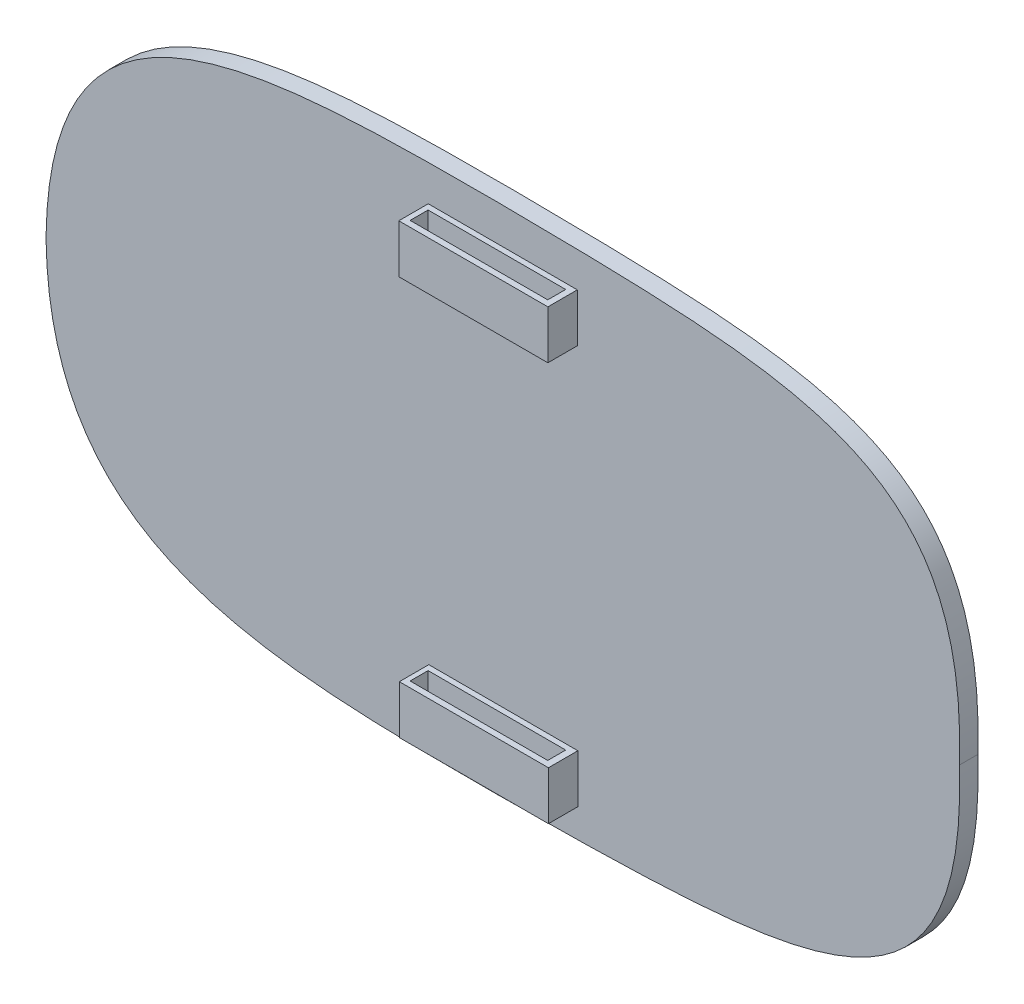
ISO-10303-21;
HEADER;
FILE_DESCRIPTION(('STEP AP214'),'2;1');
FILE_NAME('part.step','',(''),(''),'','','');
FILE_SCHEMA(('AUTOMOTIVE_DESIGN { 1 0 10303 214 1 1 1 1 }'));
ENDSEC;
DATA;
#1=APPLICATION_CONTEXT('core data for automotive mechanical design processes');
#2=APPLICATION_PROTOCOL_DEFINITION('international standard','automotive_design',2000,#1);
#3=PRODUCT_CONTEXT('',#1,'mechanical');
#4=PRODUCT('Part','Part','',(#3));
#5=PRODUCT_RELATED_PRODUCT_CATEGORY('part','',(#4));
#6=PRODUCT_DEFINITION_FORMATION('','',#4);
#7=PRODUCT_DEFINITION_CONTEXT('part definition',#1,'design');
#8=PRODUCT_DEFINITION('design','',#6,#7);
#9=PRODUCT_DEFINITION_SHAPE('','',#8);
#10=(LENGTH_UNIT() NAMED_UNIT(*) SI_UNIT(.MILLI.,.METRE.));
#11=(NAMED_UNIT(*) PLANE_ANGLE_UNIT() SI_UNIT($,.RADIAN.));
#12=(NAMED_UNIT(*) SI_UNIT($,.STERADIAN.) SOLID_ANGLE_UNIT());
#13=UNCERTAINTY_MEASURE_WITH_UNIT(LENGTH_MEASURE(1.E-05),#10,'distance_accuracy_value','');
#14=(GEOMETRIC_REPRESENTATION_CONTEXT(3) GLOBAL_UNCERTAINTY_ASSIGNED_CONTEXT((#13)) GLOBAL_UNIT_ASSIGNED_CONTEXT((#10,
#11,#12)) REPRESENTATION_CONTEXT('',''));
#15=CARTESIAN_POINT('',(0.,0.,0.));
#16=DIRECTION('',(0.,0.,1.));
#17=DIRECTION('',(1.,0.,0.));
#18=AXIS2_PLACEMENT_3D('',#15,#16,#17);
#19=CARTESIAN_POINT('',(10.1273893898623,23.3704249555768,6.5));
#20=DIRECTION('',(0.,1.,0.));
#21=DIRECTION('',(0.,0.,1.));
#22=AXIS2_PLACEMENT_3D('',#19,#20,#21);
#23=PLANE('',#22);
#24=DIRECTION('',(1.,0.,0.));
#25=VECTOR('',#24,1.);
#26=CARTESIAN_POINT('',(10.1273893898623,23.3704249555768,2.5));
#27=LINE('',#26,#25);
#28=CARTESIAN_POINT('',(-10.1273893898623,23.3704249555768,2.5));
#29=VERTEX_POINT('',#28);
#30=CARTESIAN_POINT('',(10.1273893898623,23.3704249555768,2.5));
#31=VERTEX_POINT('',#30);
#32=EDGE_CURVE('E279',#29,#31,#27,.T.);
#33=ORIENTED_EDGE('',*,*,#32,.T.);
#34=DIRECTION('',(0.,0.,-1.));
#35=VECTOR('',#34,1.);
#36=CARTESIAN_POINT('',(10.1273893898623,23.3704249555768,6.5));
#37=LINE('',#36,#35);
#38=CARTESIAN_POINT('',(10.1273893898623,23.3704249555768,6.5));
#39=VERTEX_POINT('',#38);
#40=EDGE_CURVE('E297',#39,#31,#37,.T.);
#41=ORIENTED_EDGE('',*,*,#40,.F.);
#42=DIRECTION('',(1.,0.,0.));
#43=VECTOR('',#42,1.);
#44=CARTESIAN_POINT('',(10.1273893898623,23.3704249555768,6.5));
#45=LINE('',#44,#43);
#46=CARTESIAN_POINT('',(-10.1273893898623,23.3704249555768,6.5));
#47=VERTEX_POINT('',#46);
#48=EDGE_CURVE('E265',#47,#39,#45,.T.);
#49=ORIENTED_EDGE('',*,*,#48,.F.);
#50=DIRECTION('',(0.,0.,-1.));
#51=VECTOR('',#50,1.);
#52=CARTESIAN_POINT('',(-10.1273893898623,23.3704249555768,6.5));
#53=LINE('',#52,#51);
#54=EDGE_CURVE('E301',#47,#29,#53,.T.);
#55=ORIENTED_EDGE('',*,*,#54,.T.);
#56=EDGE_LOOP('',(#33,#41,#49,#55));
#57=FACE_BOUND('',#56,.T.);
#58=DIRECTION('',(0.,0.,-1.));
#59=VECTOR('',#58,1.);
#60=CARTESIAN_POINT('',(-9.40312700516705,23.3704249555768,6.5));
#61=LINE('',#60,#59);
#62=CARTESIAN_POINT('',(-9.40312700516705,23.3704249555768,5.68871343192532));
#63=VERTEX_POINT('',#62);
#64=CARTESIAN_POINT('',(-9.40312700516705,23.3704249555768,3.24472443461106));
#65=VERTEX_POINT('',#64);
#66=EDGE_CURVE('E212',#63,#65,#61,.T.);
#67=ORIENTED_EDGE('',*,*,#66,.F.);
#68=DIRECTION('',(-1.,0.,0.));
#69=VECTOR('',#68,1.);
#70=CARTESIAN_POINT('',(10.1273893898623,23.3704249555768,5.68871343192532));
#71=LINE('',#70,#69);
#72=CARTESIAN_POINT('',(9.293388824287,23.3704249555768,5.68871343192532));
#73=VERTEX_POINT('',#72);
#74=EDGE_CURVE('E190',#73,#63,#71,.T.);
#75=ORIENTED_EDGE('',*,*,#74,.F.);
#76=DIRECTION('',(0.,0.,1.));
#77=VECTOR('',#76,1.);
#78=CARTESIAN_POINT('',(9.293388824287,23.3704249555768,6.5));
#79=LINE('',#78,#77);
#80=CARTESIAN_POINT('',(9.293388824287,23.3704249555768,3.24472443461106));
#81=VERTEX_POINT('',#80);
#82=EDGE_CURVE('E180',#81,#73,#79,.T.);
#83=ORIENTED_EDGE('',*,*,#82,.F.);
#84=DIRECTION('',(1.,0.,0.));
#85=VECTOR('',#84,1.);
#86=CARTESIAN_POINT('',(10.1273893898623,23.3704249555768,3.24472443461106));
#87=LINE('',#86,#85);
#88=EDGE_CURVE('E168',#65,#81,#87,.T.);
#89=ORIENTED_EDGE('',*,*,#88,.F.);
#90=EDGE_LOOP('',(#67,#75,#83,#89));
#91=FACE_BOUND('',#90,.T.);
#92=ADVANCED_FACE('F45',(#57,#91),#23,.F.);
#93=CARTESIAN_POINT('',(10.1273893898623,29.9549496900139,6.5));
#94=DIRECTION('',(0.,-1.,0.));
#95=DIRECTION('',(0.,0.,-1.));
#96=AXIS2_PLACEMENT_3D('',#93,#94,#95);
#97=PLANE('',#96);
#98=DIRECTION('',(-1.,0.,0.));
#99=VECTOR('',#98,1.);
#100=CARTESIAN_POINT('',(10.1273893898623,29.9549496900139,2.5));
#101=LINE('',#100,#99);
#102=CARTESIAN_POINT('',(10.1273893898623,29.9549496900139,2.5));
#103=VERTEX_POINT('',#102);
#104=CARTESIAN_POINT('',(-10.1273893898623,29.9549496900139,2.5));
#105=VERTEX_POINT('',#104);
#106=EDGE_CURVE('E266',#103,#105,#101,.T.);
#107=ORIENTED_EDGE('',*,*,#106,.T.);
#108=DIRECTION('',(0.,0.,-1.));
#109=VECTOR('',#108,1.);
#110=CARTESIAN_POINT('',(-10.1273893898623,29.9549496900139,6.5));
#111=LINE('',#110,#109);
#112=CARTESIAN_POINT('',(-10.1273893898623,29.9549496900139,6.5));
#113=VERTEX_POINT('',#112);
#114=EDGE_CURVE('E275',#113,#105,#111,.T.);
#115=ORIENTED_EDGE('',*,*,#114,.F.);
#116=DIRECTION('',(-1.,0.,0.));
#117=VECTOR('',#116,1.);
#118=CARTESIAN_POINT('',(10.1273893898623,29.9549496900139,6.5));
#119=LINE('',#118,#117);
#120=CARTESIAN_POINT('',(10.1273893898623,29.9549496900139,6.5));
#121=VERTEX_POINT('',#120);
#122=EDGE_CURVE('E272',#121,#113,#119,.T.);
#123=ORIENTED_EDGE('',*,*,#122,.F.);
#124=DIRECTION('',(0.,0.,-1.));
#125=VECTOR('',#124,1.);
#126=CARTESIAN_POINT('',(10.1273893898623,29.9549496900139,6.5));
#127=LINE('',#126,#125);
#128=EDGE_CURVE('E293',#121,#103,#127,.T.);
#129=ORIENTED_EDGE('',*,*,#128,.T.);
#130=EDGE_LOOP('',(#107,#115,#123,#129));
#131=FACE_BOUND('',#130,.T.);
#132=DIRECTION('',(0.,0.,1.));
#133=VECTOR('',#132,1.);
#134=CARTESIAN_POINT('',(-9.40312700516705,29.9549496900139,6.5));
#135=LINE('',#134,#133);
#136=CARTESIAN_POINT('',(-9.40312700516705,29.9549496900139,3.24472443461106));
#137=VERTEX_POINT('',#136);
#138=CARTESIAN_POINT('',(-9.40312700516705,29.9549496900139,5.68871343192532));
#139=VERTEX_POINT('',#138);
#140=EDGE_CURVE('E209',#137,#139,#135,.T.);
#141=ORIENTED_EDGE('',*,*,#140,.F.);
#142=DIRECTION('',(-1.,0.,0.));
#143=VECTOR('',#142,1.);
#144=CARTESIAN_POINT('',(10.1273893898623,29.9549496900139,3.24472443461106));
#145=LINE('',#144,#143);
#146=CARTESIAN_POINT('',(9.293388824287,29.9549496900139,3.24472443461106));
#147=VERTEX_POINT('',#146);
#148=EDGE_CURVE('E175',#147,#137,#145,.T.);
#149=ORIENTED_EDGE('',*,*,#148,.F.);
#150=DIRECTION('',(0.,0.,-1.));
#151=VECTOR('',#150,1.);
#152=CARTESIAN_POINT('',(9.293388824287,29.9549496900139,6.5));
#153=LINE('',#152,#151);
#154=CARTESIAN_POINT('',(9.293388824287,29.9549496900139,5.68871343192532));
#155=VERTEX_POINT('',#154);
#156=EDGE_CURVE('E183',#155,#147,#153,.T.);
#157=ORIENTED_EDGE('',*,*,#156,.F.);
#158=DIRECTION('',(1.,0.,0.));
#159=VECTOR('',#158,1.);
#160=CARTESIAN_POINT('',(10.1273893898623,29.9549496900139,5.68871343192532));
#161=LINE('',#160,#159);
#162=EDGE_CURVE('E196',#139,#155,#161,.T.);
#163=ORIENTED_EDGE('',*,*,#162,.F.);
#164=EDGE_LOOP('',(#141,#149,#157,#163));
#165=FACE_BOUND('',#164,.T.);
#166=ADVANCED_FACE('F397',(#131,#165),#97,.F.);
#167=CARTESIAN_POINT('',(10.2008708472138,-30.8263829691117,6.5));
#168=DIRECTION('',(0.,1.,0.));
#169=DIRECTION('',(-1.,0.,0.));
#170=AXIS2_PLACEMENT_3D('',#167,#168,#169);
#171=PLANE('',#170);
#172=DIRECTION('',(1.,0.,0.));
#173=VECTOR('',#172,1.);
#174=CARTESIAN_POINT('',(10.2008708472138,-30.8263829691117,2.5));
#175=LINE('',#174,#173);
#176=CARTESIAN_POINT('',(-10.053907932511,-30.8263829691118,2.5));
#177=VERTEX_POINT('',#176);
#178=CARTESIAN_POINT('',(10.2008708472138,-30.8263829691117,2.5));
#179=VERTEX_POINT('',#178);
#180=EDGE_CURVE('E234',#177,#179,#175,.T.);
#181=ORIENTED_EDGE('',*,*,#180,.T.);
#182=DIRECTION('',(0.,0.,-1.));
#183=VECTOR('',#182,1.);
#184=CARTESIAN_POINT('',(10.2008708472138,-30.8263829691117,6.5));
#185=LINE('',#184,#183);
#186=CARTESIAN_POINT('',(10.2008708472138,-30.8263829691117,6.5));
#187=VERTEX_POINT('',#186);
#188=EDGE_CURVE('E252',#187,#179,#185,.T.);
#189=ORIENTED_EDGE('',*,*,#188,.F.);
#190=DIRECTION('',(1.,0.,0.));
#191=VECTOR('',#190,1.);
#192=CARTESIAN_POINT('',(10.2008708472138,-30.8263829691117,6.5));
#193=LINE('',#192,#191);
#194=CARTESIAN_POINT('',(-10.053907932511,-30.8263829691118,6.5));
#195=VERTEX_POINT('',#194);
#196=EDGE_CURVE('E220',#195,#187,#193,.T.);
#197=ORIENTED_EDGE('',*,*,#196,.F.);
#198=DIRECTION('',(0.,0.,-1.));
#199=VECTOR('',#198,1.);
#200=CARTESIAN_POINT('',(-10.053907932511,-30.8263829691118,6.5));
#201=LINE('',#200,#199);
#202=EDGE_CURVE('E256',#195,#177,#201,.T.);
#203=ORIENTED_EDGE('',*,*,#202,.T.);
#204=EDGE_LOOP('',(#181,#189,#197,#203));
#205=FACE_BOUND('',#204,.T.);
#206=DIRECTION('',(0.,0.,-1.));
#207=VECTOR('',#206,1.);
#208=CARTESIAN_POINT('',(-9.40312700516705,-30.8263829691118,6.5));
#209=LINE('',#208,#207);
#210=CARTESIAN_POINT('',(-9.40312700516705,-30.8263829691117,5.68871343192532));
#211=VERTEX_POINT('',#210);
#212=CARTESIAN_POINT('',(-9.40312700516705,-30.8263829691118,3.24472443461106));
#213=VERTEX_POINT('',#212);
#214=EDGE_CURVE('E205',#211,#213,#209,.T.);
#215=ORIENTED_EDGE('',*,*,#214,.F.);
#216=DIRECTION('',(-1.,0.,0.));
#217=VECTOR('',#216,1.);
#218=CARTESIAN_POINT('',(10.2008708472138,-30.8263829691117,5.68871343192532));
#219=LINE('',#218,#217);
#220=CARTESIAN_POINT('',(9.293388824287,-30.8263829691117,5.68871343192532));
#221=VERTEX_POINT('',#220);
#222=EDGE_CURVE('E192',#221,#211,#219,.T.);
#223=ORIENTED_EDGE('',*,*,#222,.F.);
#224=DIRECTION('',(0.,0.,1.));
#225=VECTOR('',#224,1.);
#226=CARTESIAN_POINT('',(9.293388824287,-30.8263829691117,6.5));
#227=LINE('',#226,#225);
#228=CARTESIAN_POINT('',(9.293388824287,-30.8263829691117,3.24472443461106));
#229=VERTEX_POINT('',#228);
#230=EDGE_CURVE('E174',#229,#221,#227,.T.);
#231=ORIENTED_EDGE('',*,*,#230,.F.);
#232=DIRECTION('',(1.,0.,0.));
#233=VECTOR('',#232,1.);
#234=CARTESIAN_POINT('',(10.2008708472138,-30.8263829691117,3.24472443461106));
#235=LINE('',#234,#233);
#236=EDGE_CURVE('E452',#213,#229,#235,.T.);
#237=ORIENTED_EDGE('',*,*,#236,.F.);
#238=EDGE_LOOP('',(#215,#223,#231,#237));
#239=FACE_BOUND('',#238,.T.);
#240=ADVANCED_FACE('F405',(#205,#239),#171,.F.);
#241=CARTESIAN_POINT('',(10.2008708472138,-24.2418582346746,6.5));
#242=DIRECTION('',(0.,-1.,0.));
#243=DIRECTION('',(1.,0.,0.));
#244=AXIS2_PLACEMENT_3D('',#241,#242,#243);
#245=PLANE('',#244);
#246=DIRECTION('',(-1.,0.,0.));
#247=VECTOR('',#246,1.);
#248=CARTESIAN_POINT('',(10.2008708472138,-24.2418582346746,2.5));
#249=LINE('',#248,#247);
#250=CARTESIAN_POINT('',(10.2008708472138,-24.2418582346746,2.5));
#251=VERTEX_POINT('',#250);
#252=CARTESIAN_POINT('',(-10.053907932511,-24.2418582346746,2.5));
#253=VERTEX_POINT('',#252);
#254=EDGE_CURVE('E221',#251,#253,#249,.T.);
#255=ORIENTED_EDGE('',*,*,#254,.T.);
#256=DIRECTION('',(0.,0.,-1.));
#257=VECTOR('',#256,1.);
#258=CARTESIAN_POINT('',(-10.053907932511,-24.2418582346746,6.5));
#259=LINE('',#258,#257);
#260=CARTESIAN_POINT('',(-10.053907932511,-24.2418582346746,6.5));
#261=VERTEX_POINT('',#260);
#262=EDGE_CURVE('E230',#261,#253,#259,.T.);
#263=ORIENTED_EDGE('',*,*,#262,.F.);
#264=DIRECTION('',(-1.,0.,0.));
#265=VECTOR('',#264,1.);
#266=CARTESIAN_POINT('',(10.2008708472138,-24.2418582346746,6.5));
#267=LINE('',#266,#265);
#268=CARTESIAN_POINT('',(10.2008708472138,-24.2418582346746,6.5));
#269=VERTEX_POINT('',#268);
#270=EDGE_CURVE('E227',#269,#261,#267,.T.);
#271=ORIENTED_EDGE('',*,*,#270,.F.);
#272=DIRECTION('',(0.,0.,-1.));
#273=VECTOR('',#272,1.);
#274=CARTESIAN_POINT('',(10.2008708472138,-24.2418582346746,6.5));
#275=LINE('',#274,#273);
#276=EDGE_CURVE('E248',#269,#251,#275,.T.);
#277=ORIENTED_EDGE('',*,*,#276,.T.);
#278=EDGE_LOOP('',(#255,#263,#271,#277));
#279=FACE_BOUND('',#278,.T.);
#280=DIRECTION('',(0.,0.,1.));
#281=VECTOR('',#280,1.);
#282=CARTESIAN_POINT('',(-9.40312700516705,-24.2418582346746,6.5));
#283=LINE('',#282,#281);
#284=CARTESIAN_POINT('',(-9.40312700516705,-24.2418582346746,3.24472443461106));
#285=VERTEX_POINT('',#284);
#286=CARTESIAN_POINT('',(-9.40312700516705,-24.2418582346746,5.68871343192532));
#287=VERTEX_POINT('',#286);
#288=EDGE_CURVE('E11',#285,#287,#283,.T.);
#289=ORIENTED_EDGE('',*,*,#288,.F.);
#290=DIRECTION('',(-1.,0.,0.));
#291=VECTOR('',#290,1.);
#292=CARTESIAN_POINT('',(10.2008708472138,-24.2418582346746,3.24472443461106));
#293=LINE('',#292,#291);
#294=CARTESIAN_POINT('',(9.293388824287,-24.2418582346746,3.24472443461106));
#295=VERTEX_POINT('',#294);
#296=EDGE_CURVE('E495',#295,#285,#293,.T.);
#297=ORIENTED_EDGE('',*,*,#296,.F.);
#298=DIRECTION('',(0.,0.,-1.));
#299=VECTOR('',#298,1.);
#300=CARTESIAN_POINT('',(9.293388824287,-24.2418582346746,6.5));
#301=LINE('',#300,#299);
#302=CARTESIAN_POINT('',(9.293388824287,-24.2418582346746,5.68871343192532));
#303=VERTEX_POINT('',#302);
#304=EDGE_CURVE('E466',#303,#295,#301,.T.);
#305=ORIENTED_EDGE('',*,*,#304,.F.);
#306=DIRECTION('',(1.,0.,0.));
#307=VECTOR('',#306,1.);
#308=CARTESIAN_POINT('',(10.2008708472138,-24.2418582346746,5.68871343192532));
#309=LINE('',#308,#307);
#310=EDGE_CURVE('E55',#287,#303,#309,.T.);
#311=ORIENTED_EDGE('',*,*,#310,.F.);
#312=EDGE_LOOP('',(#289,#297,#305,#311));
#313=FACE_BOUND('',#312,.T.);
#314=ADVANCED_FACE('F365',(#279,#313),#245,.F.);
#315=CARTESIAN_POINT('',(9.05892983638027,-34.7614936978268,2.5));
#316=DIRECTION('',(0.,0.,-1.));
#317=DIRECTION('',(-1.,0.,0.));
#318=AXIS2_PLACEMENT_3D('',#315,#316,#317);
#319=PLANE('',#318);
#320=DIRECTION('',(0.,-1.,0.));
#321=VECTOR('',#320,1.);
#322=CARTESIAN_POINT('',(-10.1273893898623,29.9549496900139,2.5));
#323=LINE('',#322,#321);
#324=EDGE_CURVE('E260',#105,#29,#323,.T.);
#325=ORIENTED_EDGE('',*,*,#324,.F.);
#326=ORIENTED_EDGE('',*,*,#106,.F.);
#327=DIRECTION('',(0.,1.,0.));
#328=VECTOR('',#327,1.);
#329=CARTESIAN_POINT('',(10.1273893898623,29.9549496900139,2.5));
#330=LINE('',#329,#328);
#331=EDGE_CURVE('E283',#31,#103,#330,.T.);
#332=ORIENTED_EDGE('',*,*,#331,.F.);
#333=ORIENTED_EDGE('',*,*,#32,.F.);
#334=EDGE_LOOP('',(#325,#326,#332,#333));
#335=FACE_BOUND('',#334,.T.);
#336=CARTESIAN_POINT('',(-62.0645052721071,-0.0046378516752579,2.5));
#337=CARTESIAN_POINT('',(-61.6219091172194,-32.559891900284,2.5));
#338=CARTESIAN_POINT('',(-30.1745274655576,-35.1959915777742,2.5));
#339=CARTESIAN_POINT('',(40.855407494588,-34.4946535814501,2.5));
#340=CARTESIAN_POINT('',(63.0683349207082,-31.0445136088214,2.5));
#341=CARTESIAN_POINT('',(62.0438214704349,-0.00463785167502626,2.5));
#342=B_SPLINE_CURVE_WITH_KNOTS('',3,(#336,#337,#338,#339,#340,#341),.UNSPECIFIED.,.F.,.F.,(4,1,
1,4),(0.,0.421952335093141,0.521952335093141,1.),.UNSPECIFIED.);
#343=CARTESIAN_POINT('',(-62.0645052721071,-0.0046378516752579,2.5));
#344=VERTEX_POINT('',#343);
#345=CARTESIAN_POINT('',(62.0438214704349,-0.00463785167548953,2.5));
#346=VERTEX_POINT('',#345);
#347=EDGE_CURVE('E329',#344,#346,#342,.T.);
#348=ORIENTED_EDGE('',*,*,#347,.T.);
#349=CARTESIAN_POINT('',(-62.0645052721071,-0.0046378516752579,2.5));
#350=CARTESIAN_POINT('',(-61.6219091172194,32.5506161969335,2.5));
#351=CARTESIAN_POINT('',(-30.1745274655576,35.1867158744237,2.5));
#352=CARTESIAN_POINT('',(40.855407494588,34.4853778780996,2.5));
#353=CARTESIAN_POINT('',(63.0683349207081,31.0352379054707,2.5));
#354=CARTESIAN_POINT('',(62.0438214704349,-0.00463785167548953,2.5));
#355=B_SPLINE_CURVE_WITH_KNOTS('',3,(#349,#350,#351,#352,#353,#354),.UNSPECIFIED.,.F.,.F.,(4,1,
1,4),(0.,0.421952335093141,0.521952335093141,1.),.UNSPECIFIED.);
#356=EDGE_CURVE('E335',#344,#346,#355,.T.);
#357=ORIENTED_EDGE('',*,*,#356,.F.);
#358=EDGE_LOOP('',(#348,#357));
#359=FACE_BOUND('',#358,.T.);
#360=DIRECTION('',(0.,-1.,0.));
#361=VECTOR('',#360,1.);
#362=CARTESIAN_POINT('',(-10.053907932511,-24.2418582346746,2.5));
#363=LINE('',#362,#361);
#364=EDGE_CURVE('E215',#253,#177,#363,.T.);
#365=ORIENTED_EDGE('',*,*,#364,.F.);
#366=ORIENTED_EDGE('',*,*,#254,.F.);
#367=DIRECTION('',(0.,1.,0.));
#368=VECTOR('',#367,1.);
#369=CARTESIAN_POINT('',(10.2008708472138,-24.2418582346746,2.5));
#370=LINE('',#369,#368);
#371=EDGE_CURVE('E238',#179,#251,#370,.T.);
#372=ORIENTED_EDGE('',*,*,#371,.F.);
#373=ORIENTED_EDGE('',*,*,#180,.F.);
#374=EDGE_LOOP('',(#365,#366,#372,#373));
#375=FACE_BOUND('',#374,.T.);
#376=ADVANCED_FACE('F362',(#335,#359,#375),#319,.F.);
#377=DIRECTION('',(0.,0.,-1.));
#378=VECTOR('',#377,1.);
#379=SURFACE_OF_LINEAR_EXTRUSION('',#342,#378);
#380=CARTESIAN_POINT('',(-62.0645052721071,-0.0046378516752579,0.));
#381=CARTESIAN_POINT('',(-61.6219091172194,-32.559891900284,0.));
#382=CARTESIAN_POINT('',(-30.1745274655576,-35.1959915777742,0.));
#383=CARTESIAN_POINT('',(40.855407494588,-34.4946535814501,0.));
#384=CARTESIAN_POINT('',(63.0683349207082,-31.0445136088214,0.));
#385=CARTESIAN_POINT('',(62.0438214704349,-0.00463785167502626,0.));
#386=B_SPLINE_CURVE_WITH_KNOTS('',3,(#380,#381,#382,#383,#384,#385),.UNSPECIFIED.,.F.,.F.,(4,1,
1,4),(0.,0.421952335093141,0.521952335093141,1.),.UNSPECIFIED.);
#387=CARTESIAN_POINT('',(-62.0645052721071,-0.0046378516752579,0.));
#388=VERTEX_POINT('',#387);
#389=CARTESIAN_POINT('',(62.0438214704349,-0.00463785167548953,0.));
#390=VERTEX_POINT('',#389);
#391=EDGE_CURVE('E310',#388,#390,#386,.T.);
#392=ORIENTED_EDGE('',*,*,#391,.T.);
#393=DIRECTION('',(0.,0.,-1.));
#394=VECTOR('',#393,1.);
#395=CARTESIAN_POINT('',(62.0438214704349,-0.00463785167548953,2.5));
#396=LINE('',#395,#394);
#397=EDGE_CURVE('E500',#346,#390,#396,.T.);
#398=ORIENTED_EDGE('',*,*,#397,.F.);
#399=ORIENTED_EDGE('',*,*,#347,.F.);
#400=DIRECTION('',(0.,0.,-1.));
#401=VECTOR('',#400,1.);
#402=CARTESIAN_POINT('',(-62.0645052721071,-0.0046378516752579,2.5));
#403=LINE('',#402,#401);
#404=EDGE_CURVE('E346',#344,#388,#403,.T.);
#405=ORIENTED_EDGE('',*,*,#404,.T.);
#406=EDGE_LOOP('',(#392,#398,#399,#405));
#407=FACE_BOUND('',#406,.T.);
#408=ADVANCED_FACE('F47',(#407),#379,.F.);
#409=DIRECTION('',(0.,0.,-1.));
#410=VECTOR('',#409,1.);
#411=SURFACE_OF_LINEAR_EXTRUSION('',#355,#410);
#412=CARTESIAN_POINT('',(-62.0645052721071,-0.0046378516752579,0.));
#413=CARTESIAN_POINT('',(-61.6219091172194,32.5506161969335,0.));
#414=CARTESIAN_POINT('',(-30.1745274655576,35.1867158744237,0.));
#415=CARTESIAN_POINT('',(40.855407494588,34.4853778780996,0.));
#416=CARTESIAN_POINT('',(63.0683349207081,31.0352379054707,0.));
#417=CARTESIAN_POINT('',(62.0438214704349,-0.00463785167548953,0.));
#418=B_SPLINE_CURVE_WITH_KNOTS('',3,(#412,#413,#414,#415,#416,#417),.UNSPECIFIED.,.F.,.F.,(4,1,
1,4),(0.,0.421952335093141,0.521952335093141,1.),.UNSPECIFIED.);
#419=EDGE_CURVE('E336',#388,#390,#418,.T.);
#420=ORIENTED_EDGE('',*,*,#419,.F.);
#421=ORIENTED_EDGE('',*,*,#404,.F.);
#422=ORIENTED_EDGE('',*,*,#356,.T.);
#423=ORIENTED_EDGE('',*,*,#397,.T.);
#424=EDGE_LOOP('',(#420,#421,#422,#423));
#425=FACE_BOUND('',#424,.T.);
#426=ADVANCED_FACE('F353',(#425),#411,.T.);
#427=CARTESIAN_POINT('',(9.05892983638027,-34.7614936978268,0.));
#428=DIRECTION('',(0.,0.,-1.));
#429=DIRECTION('',(-1.,0.,0.));
#430=AXIS2_PLACEMENT_3D('',#427,#428,#429);
#431=PLANE('',#430);
#432=CARTESIAN_POINT('',(51.0092188967519,21.8083759262484,0.));
#433=DIRECTION('',(0.,0.,1.));
#434=DIRECTION('',(1.,0.,0.));
#435=AXIS2_PLACEMENT_3D('',#432,#433,#434);
#436=CIRCLE('',#435,2.75);
#437=CARTESIAN_POINT('',(53.7592188967519,21.8083759262484,0.));
#438=VERTEX_POINT('',#437);
#439=EDGE_CURVE('E311',#438,#438,#436,.T.);
#440=ORIENTED_EDGE('',*,*,#439,.T.);
#441=EDGE_LOOP('',(#440));
#442=FACE_BOUND('',#441,.T.);
#443=CARTESIAN_POINT('',(-55.2862119488537,0.,0.));
#444=DIRECTION('',(0.,0.,1.));
#445=DIRECTION('',(1.,0.,0.));
#446=AXIS2_PLACEMENT_3D('',#443,#444,#445);
#447=CIRCLE('',#446,2.75000000000001);
#448=CARTESIAN_POINT('',(-52.5362119488537,0.,0.));
#449=VERTEX_POINT('',#448);
#450=EDGE_CURVE('E315',#449,#449,#447,.T.);
#451=ORIENTED_EDGE('',*,*,#450,.T.);
#452=EDGE_LOOP('',(#451));
#453=FACE_BOUND('',#452,.T.);
#454=CARTESIAN_POINT('',(52.8629638788374,-19.1828592983185,0.));
#455=DIRECTION('',(0.,0.,1.));
#456=DIRECTION('',(1.,0.,0.));
#457=AXIS2_PLACEMENT_3D('',#454,#455,#456);
#458=CIRCLE('',#457,2.75000000000001);
#459=CARTESIAN_POINT('',(55.6129638788374,-19.1828592983185,0.));
#460=VERTEX_POINT('',#459);
#461=EDGE_CURVE('E323',#460,#460,#458,.T.);
#462=ORIENTED_EDGE('',*,*,#461,.T.);
#463=EDGE_LOOP('',(#462));
#464=FACE_BOUND('',#463,.T.);
#465=ORIENTED_EDGE('',*,*,#391,.F.);
#466=ORIENTED_EDGE('',*,*,#419,.T.);
#467=EDGE_LOOP('',(#465,#466));
#468=FACE_BOUND('',#467,.T.);
#469=ADVANCED_FACE('F356',(#442,#453,#464,#468),#431,.T.);
#470=CARTESIAN_POINT('',(52.8629638788374,-19.1828592983185,1.7));
#471=DIRECTION('',(0.,0.,-1.));
#472=DIRECTION('',(-1.,0.,0.));
#473=AXIS2_PLACEMENT_3D('',#470,#471,#472);
#474=CYLINDRICAL_SURFACE('',#473,2.75000000000001);
#475=CARTESIAN_POINT('',(52.8629638788374,-19.1828592983185,1.7));
#476=DIRECTION('',(0.,0.,1.));
#477=DIRECTION('',(1.,0.,0.));
#478=AXIS2_PLACEMENT_3D('',#475,#476,#477);
#479=CIRCLE('',#478,2.75000000000001);
#480=CARTESIAN_POINT('',(55.6129638788374,-19.1828592983185,1.7));
#481=VERTEX_POINT('',#480);
#482=EDGE_CURVE('E305',#481,#481,#479,.T.);
#483=ORIENTED_EDGE('',*,*,#482,.T.);
#484=EDGE_LOOP('',(#483));
#485=FACE_BOUND('',#484,.T.);
#486=ORIENTED_EDGE('',*,*,#461,.F.);
#487=EDGE_LOOP('',(#486));
#488=FACE_BOUND('',#487,.T.);
#489=ADVANCED_FACE('F360',(#485,#488),#474,.F.);
#490=CARTESIAN_POINT('',(52.8629638788374,-19.1828592983185,1.7));
#491=DIRECTION('',(0.,0.,1.));
#492=DIRECTION('',(1.,0.,0.));
#493=AXIS2_PLACEMENT_3D('',#490,#491,#492);
#494=PLANE('',#493);
#495=ORIENTED_EDGE('',*,*,#482,.F.);
#496=EDGE_LOOP('',(#495));
#497=FACE_BOUND('',#496,.T.);
#498=ADVANCED_FACE('F367',(#497),#494,.F.);
#499=CARTESIAN_POINT('',(-55.2862119488537,0.,1.7));
#500=DIRECTION('',(0.,0.,-1.));
#501=DIRECTION('',(-1.,0.,0.));
#502=AXIS2_PLACEMENT_3D('',#499,#500,#501);
#503=CYLINDRICAL_SURFACE('',#502,2.75000000000001);
#504=CARTESIAN_POINT('',(-55.2862119488537,0.,1.7));
#505=DIRECTION('',(0.,0.,1.));
#506=DIRECTION('',(1.,0.,0.));
#507=AXIS2_PLACEMENT_3D('',#504,#505,#506);
#508=CIRCLE('',#507,2.75000000000001);
#509=CARTESIAN_POINT('',(-52.5362119488537,0.,1.7));
#510=VERTEX_POINT('',#509);
#511=EDGE_CURVE('E319',#510,#510,#508,.T.);
#512=ORIENTED_EDGE('',*,*,#511,.T.);
#513=EDGE_LOOP('',(#512));
#514=FACE_BOUND('',#513,.T.);
#515=ORIENTED_EDGE('',*,*,#450,.F.);
#516=EDGE_LOOP('',(#515));
#517=FACE_BOUND('',#516,.T.);
#518=ADVANCED_FACE('F370',(#514,#517),#503,.F.);
#519=CARTESIAN_POINT('',(-55.2862119488537,0.,1.7));
#520=DIRECTION('',(0.,0.,1.));
#521=DIRECTION('',(1.,0.,0.));
#522=AXIS2_PLACEMENT_3D('',#519,#520,#521);
#523=PLANE('',#522);
#524=ORIENTED_EDGE('',*,*,#511,.F.);
#525=EDGE_LOOP('',(#524));
#526=FACE_BOUND('',#525,.T.);
#527=ADVANCED_FACE('F375',(#526),#523,.F.);
#528=CARTESIAN_POINT('',(51.0092188967519,21.8083759262484,1.7));
#529=DIRECTION('',(0.,0.,-1.));
#530=DIRECTION('',(-1.,0.,0.));
#531=AXIS2_PLACEMENT_3D('',#528,#529,#530);
#532=CYLINDRICAL_SURFACE('',#531,2.75);
#533=CARTESIAN_POINT('',(51.0092188967519,21.8083759262484,1.7));
#534=DIRECTION('',(0.,0.,1.));
#535=DIRECTION('',(1.,0.,0.));
#536=AXIS2_PLACEMENT_3D('',#533,#534,#535);
#537=CIRCLE('',#536,2.75);
#538=CARTESIAN_POINT('',(53.7592188967519,21.8083759262484,1.7));
#539=VERTEX_POINT('',#538);
#540=EDGE_CURVE('E306',#539,#539,#537,.T.);
#541=ORIENTED_EDGE('',*,*,#540,.T.);
#542=EDGE_LOOP('',(#541));
#543=FACE_BOUND('',#542,.T.);
#544=ORIENTED_EDGE('',*,*,#439,.F.);
#545=EDGE_LOOP('',(#544));
#546=FACE_BOUND('',#545,.T.);
#547=ADVANCED_FACE('F378',(#543,#546),#532,.F.);
#548=CARTESIAN_POINT('',(51.0092188967519,21.8083759262484,1.7));
#549=DIRECTION('',(0.,0.,1.));
#550=DIRECTION('',(1.,0.,0.));
#551=AXIS2_PLACEMENT_3D('',#548,#549,#550);
#552=PLANE('',#551);
#553=ORIENTED_EDGE('',*,*,#540,.F.);
#554=EDGE_LOOP('',(#553));
#555=FACE_BOUND('',#554,.T.);
#556=ADVANCED_FACE('F385',(#555),#552,.F.);
#557=CARTESIAN_POINT('',(-10.1273893898623,29.9549496900139,6.5));
#558=DIRECTION('',(1.,0.,0.));
#559=DIRECTION('',(0.,0.,-1.));
#560=AXIS2_PLACEMENT_3D('',#557,#558,#559);
#561=PLANE('',#560);
#562=ORIENTED_EDGE('',*,*,#324,.T.);
#563=ORIENTED_EDGE('',*,*,#54,.F.);
#564=DIRECTION('',(0.,-1.,0.));
#565=VECTOR('',#564,1.);
#566=CARTESIAN_POINT('',(-10.1273893898623,29.9549496900139,6.5));
#567=LINE('',#566,#565);
#568=EDGE_CURVE('E261',#113,#47,#567,.T.);
#569=ORIENTED_EDGE('',*,*,#568,.F.);
#570=ORIENTED_EDGE('',*,*,#114,.T.);
#571=EDGE_LOOP('',(#562,#563,#569,#570));
#572=FACE_BOUND('',#571,.T.);
#573=ADVANCED_FACE('F389',(#572),#561,.F.);
#574=CARTESIAN_POINT('',(10.1273893898623,29.9549496900139,6.5));
#575=DIRECTION('',(-1.,0.,0.));
#576=DIRECTION('',(0.,0.,1.));
#577=AXIS2_PLACEMENT_3D('',#574,#575,#576);
#578=PLANE('',#577);
#579=ORIENTED_EDGE('',*,*,#331,.T.);
#580=ORIENTED_EDGE('',*,*,#128,.F.);
#581=DIRECTION('',(0.,1.,0.));
#582=VECTOR('',#581,1.);
#583=CARTESIAN_POINT('',(10.1273893898623,29.9549496900139,6.5));
#584=LINE('',#583,#582);
#585=EDGE_CURVE('E269',#39,#121,#584,.T.);
#586=ORIENTED_EDGE('',*,*,#585,.F.);
#587=ORIENTED_EDGE('',*,*,#40,.T.);
#588=EDGE_LOOP('',(#579,#580,#586,#587));
#589=FACE_BOUND('',#588,.T.);
#590=ADVANCED_FACE('F393',(#589),#578,.F.);
#591=CARTESIAN_POINT('',(0.,0.,6.5));
#592=DIRECTION('',(0.,0.,-1.));
#593=DIRECTION('',(-1.,0.,0.));
#594=AXIS2_PLACEMENT_3D('',#591,#592,#593);
#595=PLANE('',#594);
#596=ORIENTED_EDGE('',*,*,#568,.T.);
#597=ORIENTED_EDGE('',*,*,#48,.T.);
#598=ORIENTED_EDGE('',*,*,#585,.T.);
#599=ORIENTED_EDGE('',*,*,#122,.T.);
#600=EDGE_LOOP('',(#596,#597,#598,#599));
#601=FACE_BOUND('',#600,.T.);
#602=ADVANCED_FACE('F401',(#601),#595,.F.);
#603=CARTESIAN_POINT('',(-10.053907932511,-24.2418582346746,6.5));
#604=DIRECTION('',(1.,0.,0.));
#605=DIRECTION('',(0.,0.,-1.));
#606=AXIS2_PLACEMENT_3D('',#603,#604,#605);
#607=PLANE('',#606);
#608=ORIENTED_EDGE('',*,*,#364,.T.);
#609=ORIENTED_EDGE('',*,*,#202,.F.);
#610=DIRECTION('',(0.,-1.,0.));
#611=VECTOR('',#610,1.);
#612=CARTESIAN_POINT('',(-10.053907932511,-24.2418582346746,6.5));
#613=LINE('',#612,#611);
#614=EDGE_CURVE('E216',#261,#195,#613,.T.);
#615=ORIENTED_EDGE('',*,*,#614,.F.);
#616=ORIENTED_EDGE('',*,*,#262,.T.);
#617=EDGE_LOOP('',(#608,#609,#615,#616));
#618=FACE_BOUND('',#617,.T.);
#619=ADVANCED_FACE('F409',(#618),#607,.F.);
#620=CARTESIAN_POINT('',(10.2008708472138,-24.2418582346746,6.5));
#621=DIRECTION('',(-1.,0.,0.));
#622=DIRECTION('',(0.,0.,1.));
#623=AXIS2_PLACEMENT_3D('',#620,#621,#622);
#624=PLANE('',#623);
#625=ORIENTED_EDGE('',*,*,#371,.T.);
#626=ORIENTED_EDGE('',*,*,#276,.F.);
#627=DIRECTION('',(0.,1.,0.));
#628=VECTOR('',#627,1.);
#629=CARTESIAN_POINT('',(10.2008708472138,-24.2418582346746,6.5));
#630=LINE('',#629,#628);
#631=EDGE_CURVE('E224',#187,#269,#630,.T.);
#632=ORIENTED_EDGE('',*,*,#631,.F.);
#633=ORIENTED_EDGE('',*,*,#188,.T.);
#634=EDGE_LOOP('',(#625,#626,#632,#633));
#635=FACE_BOUND('',#634,.T.);
#636=ADVANCED_FACE('F413',(#635),#624,.F.);
#637=CARTESIAN_POINT('',(0.,0.,6.5));
#638=DIRECTION('',(0.,0.,-1.));
#639=DIRECTION('',(-1.,0.,0.));
#640=AXIS2_PLACEMENT_3D('',#637,#638,#639);
#641=PLANE('',#640);
#642=ORIENTED_EDGE('',*,*,#614,.T.);
#643=ORIENTED_EDGE('',*,*,#196,.T.);
#644=ORIENTED_EDGE('',*,*,#631,.T.);
#645=ORIENTED_EDGE('',*,*,#270,.T.);
#646=EDGE_LOOP('',(#642,#643,#644,#645));
#647=FACE_BOUND('',#646,.T.);
#648=ADVANCED_FACE('F420',(#647),#641,.F.);
#649=CARTESIAN_POINT('',(9.293388824287,53.,3.24472443461106));
#650=DIRECTION('',(0.,0.,1.));
#651=DIRECTION('',(1.,0.,0.));
#652=AXIS2_PLACEMENT_3D('',#649,#650,#651);
#653=PLANE('',#652);
#654=ORIENTED_EDGE('',*,*,#236,.T.);
#655=DIRECTION('',(0.,-1.,0.));
#656=VECTOR('',#655,1.);
#657=CARTESIAN_POINT('',(9.293388824287,53.,3.24472443461106));
#658=LINE('',#657,#656);
#659=EDGE_CURVE('E187',#295,#229,#658,.T.);
#660=ORIENTED_EDGE('',*,*,#659,.F.);
#661=ORIENTED_EDGE('',*,*,#296,.T.);
#662=DIRECTION('',(0.,-1.,0.));
#663=VECTOR('',#662,1.);
#664=CARTESIAN_POINT('',(-9.40312700516705,53.,3.24472443461106));
#665=LINE('',#664,#663);
#666=EDGE_CURVE('E456',#285,#213,#665,.T.);
#667=ORIENTED_EDGE('',*,*,#666,.T.);
#668=EDGE_LOOP('',(#654,#660,#661,#667));
#669=FACE_BOUND('',#668,.T.);
#670=ADVANCED_FACE('F427',(#669),#653,.T.);
#671=CARTESIAN_POINT('',(9.293388824287,53.,3.24472443461106));
#672=DIRECTION('',(-1.,0.,0.));
#673=DIRECTION('',(0.,0.,1.));
#674=AXIS2_PLACEMENT_3D('',#671,#672,#673);
#675=PLANE('',#674);
#676=ORIENTED_EDGE('',*,*,#230,.T.);
#677=DIRECTION('',(0.,-1.,0.));
#678=VECTOR('',#677,1.);
#679=CARTESIAN_POINT('',(9.293388824287,53.,5.68871343192532));
#680=LINE('',#679,#678);
#681=EDGE_CURVE('E186',#303,#221,#680,.T.);
#682=ORIENTED_EDGE('',*,*,#681,.F.);
#683=ORIENTED_EDGE('',*,*,#304,.T.);
#684=ORIENTED_EDGE('',*,*,#659,.T.);
#685=EDGE_LOOP('',(#676,#682,#683,#684));
#686=FACE_BOUND('',#685,.T.);
#687=ADVANCED_FACE('F441',(#686),#675,.T.);
#688=CARTESIAN_POINT('',(9.293388824287,53.,5.68871343192532));
#689=DIRECTION('',(0.,0.,-1.));
#690=DIRECTION('',(-1.,0.,0.));
#691=AXIS2_PLACEMENT_3D('',#688,#689,#690);
#692=PLANE('',#691);
#693=ORIENTED_EDGE('',*,*,#222,.T.);
#694=DIRECTION('',(0.,-1.,0.));
#695=VECTOR('',#694,1.);
#696=CARTESIAN_POINT('',(-9.40312700516705,53.,5.68871343192532));
#697=LINE('',#696,#695);
#698=EDGE_CURVE('E474',#287,#211,#697,.T.);
#699=ORIENTED_EDGE('',*,*,#698,.F.);
#700=ORIENTED_EDGE('',*,*,#310,.T.);
#701=ORIENTED_EDGE('',*,*,#681,.T.);
#702=EDGE_LOOP('',(#693,#699,#700,#701));
#703=FACE_BOUND('',#702,.T.);
#704=ADVANCED_FACE('F438',(#703),#692,.T.);
#705=CARTESIAN_POINT('',(-9.40312700516705,53.,3.24472443461106));
#706=DIRECTION('',(1.,0.,0.));
#707=DIRECTION('',(0.,0.,-1.));
#708=AXIS2_PLACEMENT_3D('',#705,#706,#707);
#709=PLANE('',#708);
#710=ORIENTED_EDGE('',*,*,#214,.T.);
#711=ORIENTED_EDGE('',*,*,#666,.F.);
#712=ORIENTED_EDGE('',*,*,#288,.T.);
#713=ORIENTED_EDGE('',*,*,#698,.T.);
#714=EDGE_LOOP('',(#710,#711,#712,#713));
#715=FACE_BOUND('',#714,.T.);
#716=ADVANCED_FACE('F433',(#715),#709,.T.);
#717=ORIENTED_EDGE('',*,*,#66,.T.);
#718=EDGE_CURVE('E62',#137,#65,#665,.T.);
#719=ORIENTED_EDGE('',*,*,#718,.F.);
#720=ORIENTED_EDGE('',*,*,#140,.T.);
#721=EDGE_CURVE('E461',#139,#63,#697,.T.);
#722=ORIENTED_EDGE('',*,*,#721,.T.);
#723=EDGE_LOOP('',(#717,#719,#720,#722));
#724=FACE_BOUND('',#723,.T.);
#725=ADVANCED_FACE('F429',(#724),#709,.T.);
#726=ORIENTED_EDGE('',*,*,#74,.T.);
#727=ORIENTED_EDGE('',*,*,#721,.F.);
#728=ORIENTED_EDGE('',*,*,#162,.T.);
#729=EDGE_CURVE('E478',#155,#73,#680,.T.);
#730=ORIENTED_EDGE('',*,*,#729,.T.);
#731=EDGE_LOOP('',(#726,#727,#728,#730));
#732=FACE_BOUND('',#731,.T.);
#733=ADVANCED_FACE('F432',(#732),#692,.T.);
#734=ORIENTED_EDGE('',*,*,#82,.T.);
#735=ORIENTED_EDGE('',*,*,#729,.F.);
#736=ORIENTED_EDGE('',*,*,#156,.T.);
#737=EDGE_CURVE('E67',#147,#81,#658,.T.);
#738=ORIENTED_EDGE('',*,*,#737,.T.);
#739=EDGE_LOOP('',(#734,#735,#736,#738));
#740=FACE_BOUND('',#739,.T.);
#741=ADVANCED_FACE('F178',(#740),#675,.T.);
#742=ORIENTED_EDGE('',*,*,#88,.T.);
#743=ORIENTED_EDGE('',*,*,#737,.F.);
#744=ORIENTED_EDGE('',*,*,#148,.T.);
#745=ORIENTED_EDGE('',*,*,#718,.T.);
#746=EDGE_LOOP('',(#742,#743,#744,#745));
#747=FACE_BOUND('',#746,.T.);
#748=ADVANCED_FACE('F169',(#747),#653,.T.);
#749=CLOSED_SHELL('',(#92,#166,#240,#314,#376,#408,#426,#469,#489,#498,#518,#527,#547,#556,#573,
#590,#602,#619,#636,#648,#670,#687,#704,#716,#725,#733,#741,#748));
#750=MANIFOLD_SOLID_BREP('B2',#749);
#751=ADVANCED_BREP_SHAPE_REPRESENTATION('',(#18,#750),#14);
#752=SHAPE_DEFINITION_REPRESENTATION(#9,#751);
ENDSEC;
END-ISO-10303-21;
